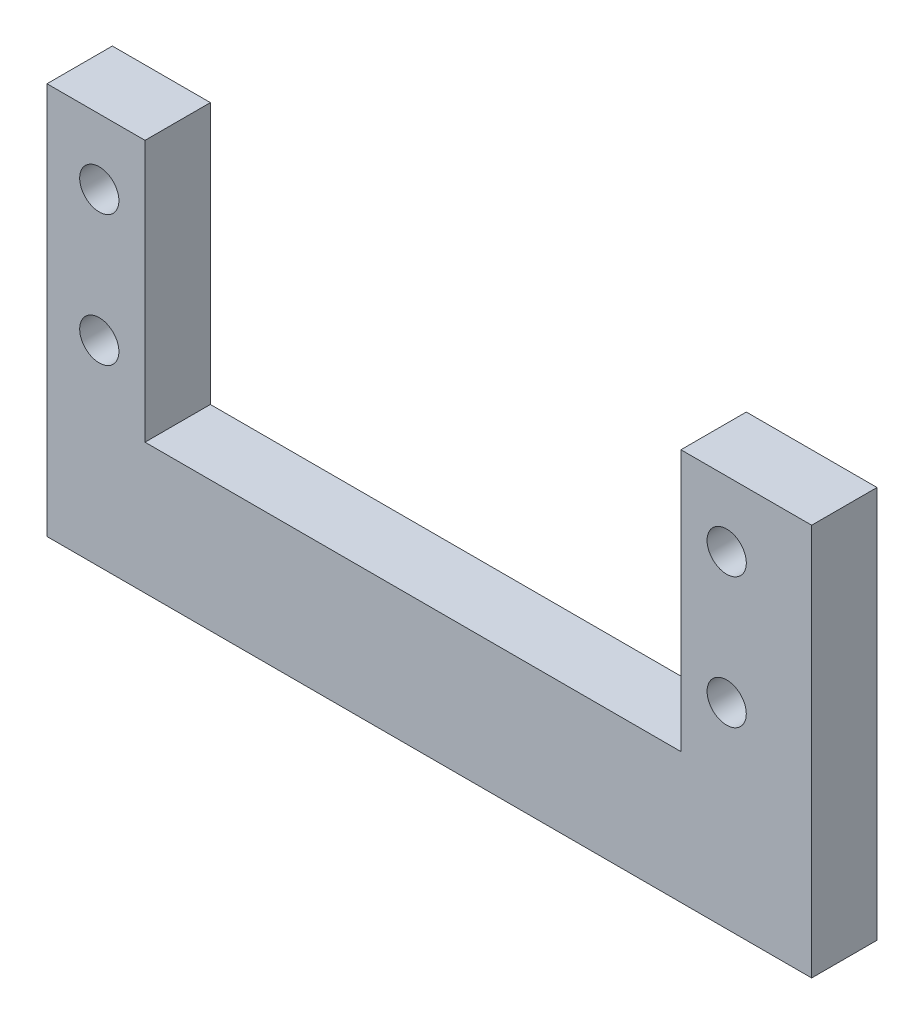
ISO-10303-21;
HEADER;
FILE_DESCRIPTION(('STEP AP214'),'2;1');
FILE_NAME('part.step','',(''),(''),'','','');
FILE_SCHEMA(('AUTOMOTIVE_DESIGN { 1 0 10303 214 1 1 1 1 }'));
ENDSEC;
DATA;
#1=APPLICATION_CONTEXT('core data for automotive mechanical design processes');
#2=APPLICATION_PROTOCOL_DEFINITION('international standard','automotive_design',2000,#1);
#3=PRODUCT_CONTEXT('',#1,'mechanical');
#4=PRODUCT('Part','Part','',(#3));
#5=PRODUCT_RELATED_PRODUCT_CATEGORY('part','',(#4));
#6=PRODUCT_DEFINITION_FORMATION('','',#4);
#7=PRODUCT_DEFINITION_CONTEXT('part definition',#1,'design');
#8=PRODUCT_DEFINITION('design','',#6,#7);
#9=PRODUCT_DEFINITION_SHAPE('','',#8);
#10=(LENGTH_UNIT() NAMED_UNIT(*) SI_UNIT(.MILLI.,.METRE.));
#11=(NAMED_UNIT(*) PLANE_ANGLE_UNIT() SI_UNIT($,.RADIAN.));
#12=(NAMED_UNIT(*) SI_UNIT($,.STERADIAN.) SOLID_ANGLE_UNIT());
#13=UNCERTAINTY_MEASURE_WITH_UNIT(LENGTH_MEASURE(1.E-05),#10,'distance_accuracy_value','');
#14=(GEOMETRIC_REPRESENTATION_CONTEXT(3) GLOBAL_UNCERTAINTY_ASSIGNED_CONTEXT((#13)) GLOBAL_UNIT_ASSIGNED_CONTEXT((#10,
#11,#12)) REPRESENTATION_CONTEXT('',''));
#15=CARTESIAN_POINT('',(0.,0.,0.));
#16=DIRECTION('',(0.,0.,1.));
#17=DIRECTION('',(1.,0.,0.));
#18=AXIS2_PLACEMENT_3D('',#15,#16,#17);
#19=CARTESIAN_POINT('',(0.,0.,5.));
#20=DIRECTION('',(0.,0.,-1.));
#21=DIRECTION('',(-1.,0.,0.));
#22=AXIS2_PLACEMENT_3D('',#19,#20,#21);
#23=PLANE('',#22);
#24=CARTESIAN_POINT('',(52.,15.,5.));
#25=DIRECTION('',(0.,0.,1.));
#26=DIRECTION('',(1.,0.,0.));
#27=AXIS2_PLACEMENT_3D('',#24,#25,#26);
#28=CIRCLE('',#27,1.5);
#29=CARTESIAN_POINT('',(53.5,15.,5.));
#30=VERTEX_POINT('',#29);
#31=EDGE_CURVE('E188',#30,#30,#28,.T.);
#32=ORIENTED_EDGE('',*,*,#31,.F.);
#33=EDGE_LOOP('',(#32));
#34=FACE_BOUND('',#33,.T.);
#35=CARTESIAN_POINT('',(4.,25.,5.));
#36=DIRECTION('',(0.,0.,1.));
#37=DIRECTION('',(1.,0.,0.));
#38=AXIS2_PLACEMENT_3D('',#35,#36,#37);
#39=CIRCLE('',#38,1.5);
#40=CARTESIAN_POINT('',(5.5,25.,5.));
#41=VERTEX_POINT('',#40);
#42=EDGE_CURVE('E134',#41,#41,#39,.T.);
#43=ORIENTED_EDGE('',*,*,#42,.F.);
#44=EDGE_LOOP('',(#43));
#45=FACE_BOUND('',#44,.T.);
#46=DIRECTION('',(0.,-1.,0.));
#47=VECTOR('',#46,1.);
#48=CARTESIAN_POINT('',(0.,0.,5.));
#49=LINE('',#48,#47);
#50=CARTESIAN_POINT('',(0.,30.,5.));
#51=VERTEX_POINT('',#50);
#52=CARTESIAN_POINT('',(0.,0.,5.));
#53=VERTEX_POINT('',#52);
#54=EDGE_CURVE('E145',#51,#53,#49,.T.);
#55=ORIENTED_EDGE('',*,*,#54,.T.);
#56=DIRECTION('',(1.,0.,0.));
#57=VECTOR('',#56,1.);
#58=CARTESIAN_POINT('',(0.,0.,5.));
#59=LINE('',#58,#57);
#60=CARTESIAN_POINT('',(58.5,0.,5.));
#61=VERTEX_POINT('',#60);
#62=EDGE_CURVE('E93',#53,#61,#59,.T.);
#63=ORIENTED_EDGE('',*,*,#62,.T.);
#64=DIRECTION('',(0.,1.,0.));
#65=VECTOR('',#64,1.);
#66=CARTESIAN_POINT('',(58.5,0.,5.));
#67=LINE('',#66,#65);
#68=CARTESIAN_POINT('',(58.5,30.,5.));
#69=VERTEX_POINT('',#68);
#70=EDGE_CURVE('E160',#61,#69,#67,.T.);
#71=ORIENTED_EDGE('',*,*,#70,.T.);
#72=DIRECTION('',(-1.,0.,0.));
#73=VECTOR('',#72,1.);
#74=CARTESIAN_POINT('',(48.5,30.,5.));
#75=LINE('',#74,#73);
#76=CARTESIAN_POINT('',(48.5,30.,5.));
#77=VERTEX_POINT('',#76);
#78=EDGE_CURVE('E173',#69,#77,#75,.T.);
#79=ORIENTED_EDGE('',*,*,#78,.T.);
#80=DIRECTION('',(0.,-1.,0.));
#81=VECTOR('',#80,1.);
#82=CARTESIAN_POINT('',(48.5,30.,5.));
#83=LINE('',#82,#81);
#84=CARTESIAN_POINT('',(48.5,10.,5.));
#85=VERTEX_POINT('',#84);
#86=EDGE_CURVE('E112',#77,#85,#83,.T.);
#87=ORIENTED_EDGE('',*,*,#86,.T.);
#88=DIRECTION('',(-1.,0.,0.));
#89=VECTOR('',#88,1.);
#90=CARTESIAN_POINT('',(7.5,10.,5.));
#91=LINE('',#90,#89);
#92=CARTESIAN_POINT('',(7.5,10.,5.));
#93=VERTEX_POINT('',#92);
#94=EDGE_CURVE('E106',#85,#93,#91,.T.);
#95=ORIENTED_EDGE('',*,*,#94,.T.);
#96=DIRECTION('',(0.,1.,0.));
#97=VECTOR('',#96,1.);
#98=CARTESIAN_POINT('',(7.5,30.,5.));
#99=LINE('',#98,#97);
#100=CARTESIAN_POINT('',(7.5,30.,5.));
#101=VERTEX_POINT('',#100);
#102=EDGE_CURVE('E110',#93,#101,#99,.T.);
#103=ORIENTED_EDGE('',*,*,#102,.T.);
#104=DIRECTION('',(-1.,0.,0.));
#105=VECTOR('',#104,1.);
#106=CARTESIAN_POINT('',(0.,30.,5.));
#107=LINE('',#106,#105);
#108=EDGE_CURVE('E50',#101,#51,#107,.T.);
#109=ORIENTED_EDGE('',*,*,#108,.T.);
#110=EDGE_LOOP('',(#55,#63,#71,#79,#87,#95,#103,#109));
#111=FACE_BOUND('',#110,.T.);
#112=CARTESIAN_POINT('',(4.,15.,5.));
#113=DIRECTION('',(0.,0.,1.));
#114=DIRECTION('',(-1.,0.,0.));
#115=AXIS2_PLACEMENT_3D('',#112,#113,#114);
#116=CIRCLE('',#115,1.5);
#117=CARTESIAN_POINT('',(2.5,15.,5.));
#118=VERTEX_POINT('',#117);
#119=EDGE_CURVE('E182',#118,#118,#116,.T.);
#120=ORIENTED_EDGE('',*,*,#119,.F.);
#121=EDGE_LOOP('',(#120));
#122=FACE_BOUND('',#121,.T.);
#123=CARTESIAN_POINT('',(52.,25.,5.));
#124=DIRECTION('',(0.,0.,1.));
#125=DIRECTION('',(-1.,0.,0.));
#126=AXIS2_PLACEMENT_3D('',#123,#124,#125);
#127=CIRCLE('',#126,1.5);
#128=CARTESIAN_POINT('',(50.5,25.,5.));
#129=VERTEX_POINT('',#128);
#130=EDGE_CURVE('E194',#129,#129,#127,.T.);
#131=ORIENTED_EDGE('',*,*,#130,.F.);
#132=EDGE_LOOP('',(#131));
#133=FACE_BOUND('',#132,.T.);
#134=ADVANCED_FACE('F33',(#34,#45,#111,#122,#133),#23,.F.);
#135=CARTESIAN_POINT('',(0.,0.,0.));
#136=DIRECTION('',(0.,0.,-1.));
#137=DIRECTION('',(-1.,0.,0.));
#138=AXIS2_PLACEMENT_3D('',#135,#136,#137);
#139=PLANE('',#138);
#140=CARTESIAN_POINT('',(52.,15.,0.));
#141=DIRECTION('',(0.,0.,1.));
#142=DIRECTION('',(1.,0.,0.));
#143=AXIS2_PLACEMENT_3D('',#140,#141,#142);
#144=CIRCLE('',#143,1.5);
#145=CARTESIAN_POINT('',(53.5,15.,0.));
#146=VERTEX_POINT('',#145);
#147=EDGE_CURVE('E191',#146,#146,#144,.T.);
#148=ORIENTED_EDGE('',*,*,#147,.T.);
#149=EDGE_LOOP('',(#148));
#150=FACE_BOUND('',#149,.T.);
#151=CARTESIAN_POINT('',(4.,25.,0.));
#152=DIRECTION('',(0.,0.,1.));
#153=DIRECTION('',(1.,0.,0.));
#154=AXIS2_PLACEMENT_3D('',#151,#152,#153);
#155=CIRCLE('',#154,1.5);
#156=CARTESIAN_POINT('',(5.5,25.,0.));
#157=VERTEX_POINT('',#156);
#158=EDGE_CURVE('E179',#157,#157,#155,.T.);
#159=ORIENTED_EDGE('',*,*,#158,.T.);
#160=EDGE_LOOP('',(#159));
#161=FACE_BOUND('',#160,.T.);
#162=DIRECTION('',(0.,-1.,0.));
#163=VECTOR('',#162,1.);
#164=CARTESIAN_POINT('',(0.,0.,0.));
#165=LINE('',#164,#163);
#166=CARTESIAN_POINT('',(0.,30.,0.));
#167=VERTEX_POINT('',#166);
#168=CARTESIAN_POINT('',(0.,0.,0.));
#169=VERTEX_POINT('',#168);
#170=EDGE_CURVE('E130',#167,#169,#165,.T.);
#171=ORIENTED_EDGE('',*,*,#170,.F.);
#172=DIRECTION('',(-1.,0.,0.));
#173=VECTOR('',#172,1.);
#174=CARTESIAN_POINT('',(0.,30.,0.));
#175=LINE('',#174,#173);
#176=CARTESIAN_POINT('',(7.5,30.,0.));
#177=VERTEX_POINT('',#176);
#178=EDGE_CURVE('E85',#177,#167,#175,.T.);
#179=ORIENTED_EDGE('',*,*,#178,.F.);
#180=DIRECTION('',(0.,1.,0.));
#181=VECTOR('',#180,1.);
#182=CARTESIAN_POINT('',(7.5,30.,0.));
#183=LINE('',#182,#181);
#184=CARTESIAN_POINT('',(7.5,10.,0.));
#185=VERTEX_POINT('',#184);
#186=EDGE_CURVE('E79',#185,#177,#183,.T.);
#187=ORIENTED_EDGE('',*,*,#186,.F.);
#188=DIRECTION('',(-1.,0.,0.));
#189=VECTOR('',#188,1.);
#190=CARTESIAN_POINT('',(7.5,10.,0.));
#191=LINE('',#190,#189);
#192=CARTESIAN_POINT('',(48.5,10.,0.));
#193=VERTEX_POINT('',#192);
#194=EDGE_CURVE('E120',#193,#185,#191,.T.);
#195=ORIENTED_EDGE('',*,*,#194,.F.);
#196=DIRECTION('',(0.,-1.,0.));
#197=VECTOR('',#196,1.);
#198=CARTESIAN_POINT('',(48.5,30.,0.));
#199=LINE('',#198,#197);
#200=CARTESIAN_POINT('',(48.5,30.,0.));
#201=VERTEX_POINT('',#200);
#202=EDGE_CURVE('E140',#201,#193,#199,.T.);
#203=ORIENTED_EDGE('',*,*,#202,.F.);
#204=DIRECTION('',(-1.,0.,0.));
#205=VECTOR('',#204,1.);
#206=CARTESIAN_POINT('',(48.5,30.,0.));
#207=LINE('',#206,#205);
#208=CARTESIAN_POINT('',(58.5,30.,0.));
#209=VERTEX_POINT('',#208);
#210=EDGE_CURVE('E138',#209,#201,#207,.T.);
#211=ORIENTED_EDGE('',*,*,#210,.F.);
#212=DIRECTION('',(0.,1.,0.));
#213=VECTOR('',#212,1.);
#214=CARTESIAN_POINT('',(58.5,0.,0.));
#215=LINE('',#214,#213);
#216=CARTESIAN_POINT('',(58.5,0.,0.));
#217=VERTEX_POINT('',#216);
#218=EDGE_CURVE('E136',#217,#209,#215,.T.);
#219=ORIENTED_EDGE('',*,*,#218,.F.);
#220=DIRECTION('',(1.,0.,0.));
#221=VECTOR('',#220,1.);
#222=CARTESIAN_POINT('',(0.,0.,0.));
#223=LINE('',#222,#221);
#224=EDGE_CURVE('E133',#169,#217,#223,.T.);
#225=ORIENTED_EDGE('',*,*,#224,.F.);
#226=EDGE_LOOP('',(#171,#179,#187,#195,#203,#211,#219,#225));
#227=FACE_BOUND('',#226,.T.);
#228=CARTESIAN_POINT('',(4.,15.,0.));
#229=DIRECTION('',(0.,0.,1.));
#230=DIRECTION('',(-1.,0.,0.));
#231=AXIS2_PLACEMENT_3D('',#228,#229,#230);
#232=CIRCLE('',#231,1.5);
#233=CARTESIAN_POINT('',(2.5,15.,0.));
#234=VERTEX_POINT('',#233);
#235=EDGE_CURVE('E185',#234,#234,#232,.T.);
#236=ORIENTED_EDGE('',*,*,#235,.T.);
#237=EDGE_LOOP('',(#236));
#238=FACE_BOUND('',#237,.T.);
#239=CARTESIAN_POINT('',(52.,25.,0.));
#240=DIRECTION('',(0.,0.,1.));
#241=DIRECTION('',(-1.,0.,0.));
#242=AXIS2_PLACEMENT_3D('',#239,#240,#241);
#243=CIRCLE('',#242,1.5);
#244=CARTESIAN_POINT('',(50.5,25.,0.));
#245=VERTEX_POINT('',#244);
#246=EDGE_CURVE('E197',#245,#245,#243,.T.);
#247=ORIENTED_EDGE('',*,*,#246,.T.);
#248=EDGE_LOOP('',(#247));
#249=FACE_BOUND('',#248,.T.);
#250=ADVANCED_FACE('F164',(#150,#161,#227,#238,#249),#139,.T.);
#251=CARTESIAN_POINT('',(0.,0.,5.));
#252=DIRECTION('',(1.,0.,0.));
#253=DIRECTION('',(0.,0.,-1.));
#254=AXIS2_PLACEMENT_3D('',#251,#252,#253);
#255=PLANE('',#254);
#256=ORIENTED_EDGE('',*,*,#170,.T.);
#257=DIRECTION('',(0.,0.,-1.));
#258=VECTOR('',#257,1.);
#259=CARTESIAN_POINT('',(0.,0.,5.));
#260=LINE('',#259,#258);
#261=EDGE_CURVE('E11',#53,#169,#260,.T.);
#262=ORIENTED_EDGE('',*,*,#261,.F.);
#263=ORIENTED_EDGE('',*,*,#54,.F.);
#264=DIRECTION('',(0.,0.,-1.));
#265=VECTOR('',#264,1.);
#266=CARTESIAN_POINT('',(0.,30.,5.));
#267=LINE('',#266,#265);
#268=EDGE_CURVE('E126',#51,#167,#267,.T.);
#269=ORIENTED_EDGE('',*,*,#268,.T.);
#270=EDGE_LOOP('',(#256,#262,#263,#269));
#271=FACE_BOUND('',#270,.T.);
#272=ADVANCED_FACE('F35',(#271),#255,.F.);
#273=CARTESIAN_POINT('',(0.,0.,5.));
#274=DIRECTION('',(0.,1.,0.));
#275=DIRECTION('',(0.,0.,1.));
#276=AXIS2_PLACEMENT_3D('',#273,#274,#275);
#277=PLANE('',#276);
#278=ORIENTED_EDGE('',*,*,#224,.T.);
#279=DIRECTION('',(0.,0.,-1.));
#280=VECTOR('',#279,1.);
#281=CARTESIAN_POINT('',(58.5,0.,5.));
#282=LINE('',#281,#280);
#283=EDGE_CURVE('E42',#61,#217,#282,.T.);
#284=ORIENTED_EDGE('',*,*,#283,.F.);
#285=ORIENTED_EDGE('',*,*,#62,.F.);
#286=ORIENTED_EDGE('',*,*,#261,.T.);
#287=EDGE_LOOP('',(#278,#284,#285,#286));
#288=FACE_BOUND('',#287,.T.);
#289=ADVANCED_FACE('F232',(#288),#277,.F.);
#290=CARTESIAN_POINT('',(58.5,0.,5.));
#291=DIRECTION('',(-1.,0.,0.));
#292=DIRECTION('',(0.,0.,1.));
#293=AXIS2_PLACEMENT_3D('',#290,#291,#292);
#294=PLANE('',#293);
#295=ORIENTED_EDGE('',*,*,#218,.T.);
#296=DIRECTION('',(0.,0.,-1.));
#297=VECTOR('',#296,1.);
#298=CARTESIAN_POINT('',(58.5,30.,5.));
#299=LINE('',#298,#297);
#300=EDGE_CURVE('E152',#69,#209,#299,.T.);
#301=ORIENTED_EDGE('',*,*,#300,.F.);
#302=ORIENTED_EDGE('',*,*,#70,.F.);
#303=ORIENTED_EDGE('',*,*,#283,.T.);
#304=EDGE_LOOP('',(#295,#301,#302,#303));
#305=FACE_BOUND('',#304,.T.);
#306=ADVANCED_FACE('F158',(#305),#294,.F.);
#307=CARTESIAN_POINT('',(48.5,30.,5.));
#308=DIRECTION('',(0.,-1.,0.));
#309=DIRECTION('',(0.,0.,-1.));
#310=AXIS2_PLACEMENT_3D('',#307,#308,#309);
#311=PLANE('',#310);
#312=ORIENTED_EDGE('',*,*,#210,.T.);
#313=DIRECTION('',(0.,0.,-1.));
#314=VECTOR('',#313,1.);
#315=CARTESIAN_POINT('',(48.5,30.,5.));
#316=LINE('',#315,#314);
#317=EDGE_CURVE('E149',#77,#201,#316,.T.);
#318=ORIENTED_EDGE('',*,*,#317,.F.);
#319=ORIENTED_EDGE('',*,*,#78,.F.);
#320=ORIENTED_EDGE('',*,*,#300,.T.);
#321=EDGE_LOOP('',(#312,#318,#319,#320));
#322=FACE_BOUND('',#321,.T.);
#323=ADVANCED_FACE('F169',(#322),#311,.F.);
#324=CARTESIAN_POINT('',(48.5,30.,5.));
#325=DIRECTION('',(1.,0.,0.));
#326=DIRECTION('',(0.,0.,-1.));
#327=AXIS2_PLACEMENT_3D('',#324,#325,#326);
#328=PLANE('',#327);
#329=ORIENTED_EDGE('',*,*,#202,.T.);
#330=DIRECTION('',(0.,0.,-1.));
#331=VECTOR('',#330,1.);
#332=CARTESIAN_POINT('',(48.5,10.,5.));
#333=LINE('',#332,#331);
#334=EDGE_CURVE('E121',#85,#193,#333,.T.);
#335=ORIENTED_EDGE('',*,*,#334,.F.);
#336=ORIENTED_EDGE('',*,*,#86,.F.);
#337=ORIENTED_EDGE('',*,*,#317,.T.);
#338=EDGE_LOOP('',(#329,#335,#336,#337));
#339=FACE_BOUND('',#338,.T.);
#340=ADVANCED_FACE('F172',(#339),#328,.F.);
#341=CARTESIAN_POINT('',(7.5,10.,5.));
#342=DIRECTION('',(0.,-1.,0.));
#343=DIRECTION('',(0.,0.,-1.));
#344=AXIS2_PLACEMENT_3D('',#341,#342,#343);
#345=PLANE('',#344);
#346=ORIENTED_EDGE('',*,*,#194,.T.);
#347=DIRECTION('',(0.,0.,-1.));
#348=VECTOR('',#347,1.);
#349=CARTESIAN_POINT('',(7.5,10.,5.));
#350=LINE('',#349,#348);
#351=EDGE_CURVE('E117',#93,#185,#350,.T.);
#352=ORIENTED_EDGE('',*,*,#351,.F.);
#353=ORIENTED_EDGE('',*,*,#94,.F.);
#354=ORIENTED_EDGE('',*,*,#334,.T.);
#355=EDGE_LOOP('',(#346,#352,#353,#354));
#356=FACE_BOUND('',#355,.T.);
#357=ADVANCED_FACE('F118',(#356),#345,.F.);
#358=CARTESIAN_POINT('',(7.5,30.,5.));
#359=DIRECTION('',(-1.,0.,0.));
#360=DIRECTION('',(0.,-1.,0.));
#361=AXIS2_PLACEMENT_3D('',#358,#359,#360);
#362=PLANE('',#361);
#363=ORIENTED_EDGE('',*,*,#186,.T.);
#364=DIRECTION('',(0.,0.,-1.));
#365=VECTOR('',#364,1.);
#366=CARTESIAN_POINT('',(7.5,30.,5.));
#367=LINE('',#366,#365);
#368=EDGE_CURVE('E122',#101,#177,#367,.T.);
#369=ORIENTED_EDGE('',*,*,#368,.F.);
#370=ORIENTED_EDGE('',*,*,#102,.F.);
#371=ORIENTED_EDGE('',*,*,#351,.T.);
#372=EDGE_LOOP('',(#363,#369,#370,#371));
#373=FACE_BOUND('',#372,.T.);
#374=ADVANCED_FACE('F124',(#373),#362,.F.);
#375=CARTESIAN_POINT('',(0.,30.,5.));
#376=DIRECTION('',(0.,-1.,0.));
#377=DIRECTION('',(0.,0.,-1.));
#378=AXIS2_PLACEMENT_3D('',#375,#376,#377);
#379=PLANE('',#378);
#380=ORIENTED_EDGE('',*,*,#178,.T.);
#381=ORIENTED_EDGE('',*,*,#268,.F.);
#382=ORIENTED_EDGE('',*,*,#108,.F.);
#383=ORIENTED_EDGE('',*,*,#368,.T.);
#384=EDGE_LOOP('',(#380,#381,#382,#383));
#385=FACE_BOUND('',#384,.T.);
#386=ADVANCED_FACE('F220',(#385),#379,.F.);
#387=CARTESIAN_POINT('',(4.,25.,5.));
#388=DIRECTION('',(0.,0.,-1.));
#389=DIRECTION('',(-1.,0.,0.));
#390=AXIS2_PLACEMENT_3D('',#387,#388,#389);
#391=CYLINDRICAL_SURFACE('',#390,1.5);
#392=ORIENTED_EDGE('',*,*,#42,.T.);
#393=EDGE_LOOP('',(#392));
#394=FACE_BOUND('',#393,.T.);
#395=ORIENTED_EDGE('',*,*,#158,.F.);
#396=EDGE_LOOP('',(#395));
#397=FACE_BOUND('',#396,.T.);
#398=ADVANCED_FACE('F217',(#394,#397),#391,.F.);
#399=CARTESIAN_POINT('',(4.,15.,5.));
#400=DIRECTION('',(0.,0.,-1.));
#401=DIRECTION('',(-1.,0.,0.));
#402=AXIS2_PLACEMENT_3D('',#399,#400,#401);
#403=CYLINDRICAL_SURFACE('',#402,1.5);
#404=ORIENTED_EDGE('',*,*,#119,.T.);
#405=EDGE_LOOP('',(#404));
#406=FACE_BOUND('',#405,.T.);
#407=ORIENTED_EDGE('',*,*,#235,.F.);
#408=EDGE_LOOP('',(#407));
#409=FACE_BOUND('',#408,.T.);
#410=ADVANCED_FACE('F296',(#406,#409),#403,.F.);
#411=CARTESIAN_POINT('',(52.,15.,5.));
#412=DIRECTION('',(0.,0.,-1.));
#413=DIRECTION('',(-1.,0.,0.));
#414=AXIS2_PLACEMENT_3D('',#411,#412,#413);
#415=CYLINDRICAL_SURFACE('',#414,1.5);
#416=ORIENTED_EDGE('',*,*,#31,.T.);
#417=EDGE_LOOP('',(#416));
#418=FACE_BOUND('',#417,.T.);
#419=ORIENTED_EDGE('',*,*,#147,.F.);
#420=EDGE_LOOP('',(#419));
#421=FACE_BOUND('',#420,.T.);
#422=ADVANCED_FACE('F304',(#418,#421),#415,.F.);
#423=CARTESIAN_POINT('',(52.,25.,5.));
#424=DIRECTION('',(0.,0.,-1.));
#425=DIRECTION('',(-1.,0.,0.));
#426=AXIS2_PLACEMENT_3D('',#423,#424,#425);
#427=CYLINDRICAL_SURFACE('',#426,1.5);
#428=ORIENTED_EDGE('',*,*,#130,.T.);
#429=EDGE_LOOP('',(#428));
#430=FACE_BOUND('',#429,.T.);
#431=ORIENTED_EDGE('',*,*,#246,.F.);
#432=EDGE_LOOP('',(#431));
#433=FACE_BOUND('',#432,.T.);
#434=ADVANCED_FACE('F203',(#430,#433),#427,.F.);
#435=CLOSED_SHELL('',(#134,#250,#272,#289,#306,#323,#340,#357,#374,#386,#398,#410,#422,#434));
#436=MANIFOLD_SOLID_BREP('B2',#435);
#437=ADVANCED_BREP_SHAPE_REPRESENTATION('',(#18,#436),#14);
#438=SHAPE_DEFINITION_REPRESENTATION(#9,#437);
ENDSEC;
END-ISO-10303-21;
